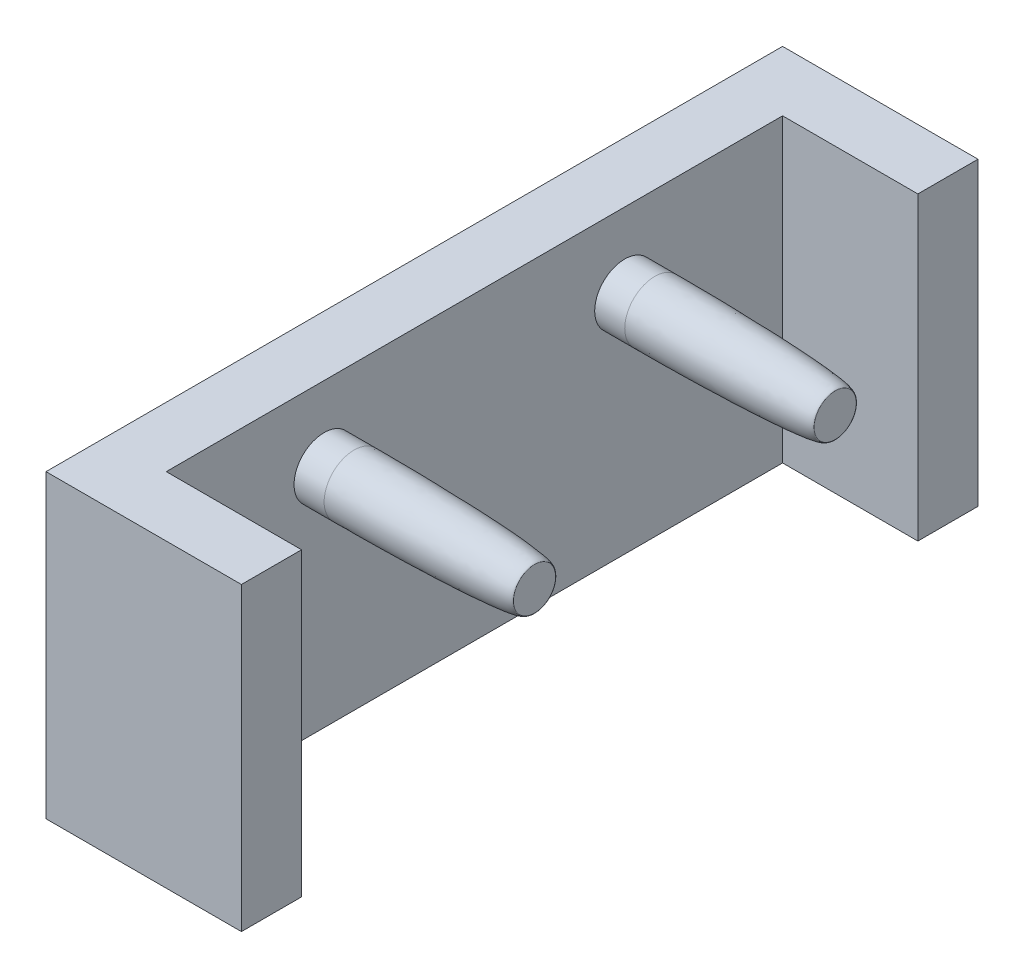
ISO-10303-21;
HEADER;
FILE_DESCRIPTION(('STEP AP214'),'2;1');
FILE_NAME('part.step','',(''),(''),'','','');
FILE_SCHEMA(('AUTOMOTIVE_DESIGN { 1 0 10303 214 1 1 1 1 }'));
ENDSEC;
DATA;
#1=APPLICATION_CONTEXT('core data for automotive mechanical design processes');
#2=APPLICATION_PROTOCOL_DEFINITION('international standard','automotive_design',2000,#1);
#3=PRODUCT_CONTEXT('',#1,'mechanical');
#4=PRODUCT('Part','Part','',(#3));
#5=PRODUCT_RELATED_PRODUCT_CATEGORY('part','',(#4));
#6=PRODUCT_DEFINITION_FORMATION('','',#4);
#7=PRODUCT_DEFINITION_CONTEXT('part definition',#1,'design');
#8=PRODUCT_DEFINITION('design','',#6,#7);
#9=PRODUCT_DEFINITION_SHAPE('','',#8);
#10=(LENGTH_UNIT() NAMED_UNIT(*) SI_UNIT(.MILLI.,.METRE.));
#11=(NAMED_UNIT(*) PLANE_ANGLE_UNIT() SI_UNIT($,.RADIAN.));
#12=(NAMED_UNIT(*) SI_UNIT($,.STERADIAN.) SOLID_ANGLE_UNIT());
#13=UNCERTAINTY_MEASURE_WITH_UNIT(LENGTH_MEASURE(1.E-05),#10,'distance_accuracy_value','');
#14=(GEOMETRIC_REPRESENTATION_CONTEXT(3) GLOBAL_UNCERTAINTY_ASSIGNED_CONTEXT((#13)) GLOBAL_UNIT_ASSIGNED_CONTEXT((#10,
#11,#12)) REPRESENTATION_CONTEXT('',''));
#15=CARTESIAN_POINT('',(0.,0.,0.));
#16=DIRECTION('',(0.,0.,1.));
#17=DIRECTION('',(1.,0.,0.));
#18=AXIS2_PLACEMENT_3D('',#15,#16,#17);
#19=CARTESIAN_POINT('',(7.,0.,5.));
#20=DIRECTION('',(-1.,0.,0.));
#21=DIRECTION('',(0.,0.,1.));
#22=AXIS2_PLACEMENT_3D('',#19,#20,#21);
#23=CYLINDRICAL_SURFACE('',#22,1.);
#24=CARTESIAN_POINT('',(1.,0.,4.));
#25=CARTESIAN_POINT('',(1.,0.261799298751802,4.));
#26=CARTESIAN_POINT('',(1.,0.52198672172927,4.10777315935618));
#27=CARTESIAN_POINT('',(1.,0.892226840643825,4.47801327827073));
#28=CARTESIAN_POINT('',(1.,1.,4.73820070124815));
#29=CARTESIAN_POINT('',(1.,1.,5.26179929875185));
#30=CARTESIAN_POINT('',(1.,0.892226840643745,5.52198672172935));
#31=CARTESIAN_POINT('',(1.,0.521986721729349,5.89222684064375));
#32=CARTESIAN_POINT('',(1.,0.261799298751748,6.));
#33=CARTESIAN_POINT('',(1.,-0.261799298751748,6.));
#34=CARTESIAN_POINT('',(1.,-0.521986721729316,5.89222684064378));
#35=CARTESIAN_POINT('',(1.,-0.89222684064378,5.52198672172932));
#36=CARTESIAN_POINT('',(1.,-1.,5.26179929875169));
#37=CARTESIAN_POINT('',(1.,-1.,4.73820070124831));
#38=CARTESIAN_POINT('',(1.,-0.892226840643798,4.47801327827071));
#39=CARTESIAN_POINT('',(1.,-0.521986721729301,4.1077731593562));
#40=CARTESIAN_POINT('',(1.,-0.261799298751802,4.));
#41=CARTESIAN_POINT('',(1.,0.,4.));
#42=(BOUNDED_CURVE() B_SPLINE_CURVE(3,(#24,#25,#26,#27,#28,#29,#30,#31,#32,#33,#34,#35,#36,#37,
#38,#39,#40,#41),.UNSPECIFIED.,.T.,.F.) B_SPLINE_CURVE_WITH_KNOTS((4,2,2,2,2,2,2,2,4),(0.,
0.785398163397448,1.5707963267949,2.35619449019234,3.14159265358979,3.92699081698724,
4.71238898038469,5.49778714378214,6.28318530717959),
.UNSPECIFIED.) CURVE() GEOMETRIC_REPRESENTATION_ITEM() RATIONAL_B_SPLINE_CURVE((1.,1.,1.,1.,1.,
1.,1.,1.,1.,1.,1.,1.,1.,1.,1.,1.,1.,1.)) REPRESENTATION_ITEM(''));
#43=CARTESIAN_POINT('',(1.,0.,4.));
#44=VERTEX_POINT('',#43);
#45=EDGE_CURVE('E275',#44,#44,#42,.F.);
#46=ORIENTED_EDGE('',*,*,#45,.T.);
#47=EDGE_LOOP('',(#46));
#48=FACE_BOUND('',#47,.T.);
#49=CARTESIAN_POINT('',(0.,0.,5.));
#50=DIRECTION('',(1.,0.,0.));
#51=DIRECTION('',(0.,0.,-1.));
#52=AXIS2_PLACEMENT_3D('',#49,#50,#51);
#53=CIRCLE('',#52,1.);
#54=CARTESIAN_POINT('',(0.,0.,4.));
#55=VERTEX_POINT('',#54);
#56=EDGE_CURVE('E174',#55,#55,#53,.T.);
#57=ORIENTED_EDGE('',*,*,#56,.T.);
#58=EDGE_LOOP('',(#57));
#59=FACE_BOUND('',#58,.T.);
#60=ADVANCED_FACE('F38',(#48,#59),#23,.T.);
#61=CARTESIAN_POINT('',(7.,0.,5.));
#62=DIRECTION('',(1.,0.,0.));
#63=DIRECTION('',(0.,0.,-1.));
#64=AXIS2_PLACEMENT_3D('',#61,#62,#63);
#65=PLANE('',#64);
#66=CARTESIAN_POINT('',(7.,0.,4.3));
#67=CARTESIAN_POINT('',(7.,-0.183259509126262,4.3));
#68=CARTESIAN_POINT('',(7.,-0.365390705210521,4.37544121154935));
#69=CARTESIAN_POINT('',(7.,-0.624558788450648,4.63460929478949));
#70=CARTESIAN_POINT('',(7.,-0.7,4.81674049087378));
#71=CARTESIAN_POINT('',(7.,-0.7,5.18325950912622));
#72=CARTESIAN_POINT('',(7.,-0.624558788450647,5.36539070521055));
#73=CARTESIAN_POINT('',(7.,-0.365390705210519,5.62455878845062));
#74=CARTESIAN_POINT('',(7.,-0.183259509126223,5.7));
#75=CARTESIAN_POINT('',(7.,0.183259509126223,5.7));
#76=CARTESIAN_POINT('',(7.,0.365390705210509,5.62455878845062));
#77=CARTESIAN_POINT('',(7.,0.624558788450657,5.36539070521055));
#78=CARTESIAN_POINT('',(7.,0.7,5.18325950912628));
#79=CARTESIAN_POINT('',(7.,0.7,4.81674049087372));
#80=CARTESIAN_POINT('',(7.,0.624558788450657,4.63460929478952));
#81=CARTESIAN_POINT('',(7.,0.365390705210509,4.37544121154931));
#82=CARTESIAN_POINT('',(7.,0.183259509126262,4.3));
#83=CARTESIAN_POINT('',(7.,0.,4.3));
#84=(BOUNDED_CURVE() B_SPLINE_CURVE(3,(#66,#67,#68,#69,#70,#71,#72,#73,#74,#75,#76,#77,#78,#79,
#80,#81,#82,#83),.UNSPECIFIED.,.T.,.F.) B_SPLINE_CURVE_WITH_KNOTS((4,2,2,2,2,2,2,2,4),(0.,
0.785398163397448,1.5707963267949,2.35619449019234,3.14159265358979,3.92699081698724,
4.71238898038469,5.49778714378214,6.28318530717959),
.UNSPECIFIED.) CURVE() GEOMETRIC_REPRESENTATION_ITEM() RATIONAL_B_SPLINE_CURVE((1.,1.,1.,1.,1.,
1.,1.,1.,1.,1.,1.,1.,1.,1.,1.,1.,1.,1.)) REPRESENTATION_ITEM(''));
#85=CARTESIAN_POINT('',(7.,0.,4.3));
#86=VERTEX_POINT('',#85);
#87=EDGE_CURVE('E186',#86,#86,#84,.F.);
#88=ORIENTED_EDGE('',*,*,#87,.T.);
#89=EDGE_LOOP('',(#88));
#90=FACE_BOUND('',#89,.T.);
#91=ADVANCED_FACE('F197',(#90),#65,.T.);
#92=CARTESIAN_POINT('',(-2.,2.5,-10.25));
#93=DIRECTION('',(0.,-1.,0.));
#94=DIRECTION('',(0.,0.,-1.));
#95=AXIS2_PLACEMENT_3D('',#92,#93,#94);
#96=PLANE('',#95);
#97=DIRECTION('',(0.,0.,-1.));
#98=VECTOR('',#97,1.);
#99=CARTESIAN_POINT('',(0.,2.5,-10.25));
#100=LINE('',#99,#98);
#101=CARTESIAN_POINT('',(0.,2.5,10.25));
#102=VERTEX_POINT('',#101);
#103=CARTESIAN_POINT('',(0.,2.5,-10.25));
#104=VERTEX_POINT('',#103);
#105=EDGE_CURVE('E67',#102,#104,#100,.T.);
#106=ORIENTED_EDGE('',*,*,#105,.T.);
#107=DIRECTION('',(-1.,0.,0.));
#108=VECTOR('',#107,1.);
#109=CARTESIAN_POINT('',(4.5,2.5,-10.25));
#110=LINE('',#109,#108);
#111=CARTESIAN_POINT('',(4.5,2.5,-10.25));
#112=VERTEX_POINT('',#111);
#113=EDGE_CURVE('E166',#112,#104,#110,.T.);
#114=ORIENTED_EDGE('',*,*,#113,.F.);
#115=DIRECTION('',(0.,0.,-1.));
#116=VECTOR('',#115,1.);
#117=CARTESIAN_POINT('',(4.5,2.5,-12.25));
#118=LINE('',#117,#116);
#119=CARTESIAN_POINT('',(4.5,2.5,-12.25));
#120=VERTEX_POINT('',#119);
#121=EDGE_CURVE('E151',#112,#120,#118,.T.);
#122=ORIENTED_EDGE('',*,*,#121,.T.);
#123=DIRECTION('',(-1.,0.,0.));
#124=VECTOR('',#123,1.);
#125=CARTESIAN_POINT('',(4.5,2.5,-12.25));
#126=LINE('',#125,#124);
#127=CARTESIAN_POINT('',(-2.,2.5,-12.25));
#128=VERTEX_POINT('',#127);
#129=EDGE_CURVE('E163',#120,#128,#126,.T.);
#130=ORIENTED_EDGE('',*,*,#129,.T.);
#131=DIRECTION('',(0.,0.,-1.));
#132=VECTOR('',#131,1.);
#133=CARTESIAN_POINT('',(-2.,2.5,-10.25));
#134=LINE('',#133,#132);
#135=CARTESIAN_POINT('',(-2.,2.5,12.25));
#136=VERTEX_POINT('',#135);
#137=EDGE_CURVE('E170',#136,#128,#134,.T.);
#138=ORIENTED_EDGE('',*,*,#137,.F.);
#139=DIRECTION('',(-1.,0.,0.));
#140=VECTOR('',#139,1.);
#141=CARTESIAN_POINT('',(4.5,2.5,12.25));
#142=LINE('',#141,#140);
#143=CARTESIAN_POINT('',(4.5,2.5,12.25));
#144=VERTEX_POINT('',#143);
#145=EDGE_CURVE('E131',#144,#136,#142,.T.);
#146=ORIENTED_EDGE('',*,*,#145,.F.);
#147=DIRECTION('',(0.,0.,-1.));
#148=VECTOR('',#147,1.);
#149=CARTESIAN_POINT('',(4.5,2.5,10.25));
#150=LINE('',#149,#148);
#151=CARTESIAN_POINT('',(4.5,2.5,10.25));
#152=VERTEX_POINT('',#151);
#153=EDGE_CURVE('E124',#144,#152,#150,.T.);
#154=ORIENTED_EDGE('',*,*,#153,.T.);
#155=DIRECTION('',(-1.,0.,0.));
#156=VECTOR('',#155,1.);
#157=CARTESIAN_POINT('',(4.5,2.5,10.25));
#158=LINE('',#157,#156);
#159=EDGE_CURVE('E109',#152,#102,#158,.T.);
#160=ORIENTED_EDGE('',*,*,#159,.T.);
#161=EDGE_LOOP('',(#106,#114,#122,#130,#138,#146,#154,#160));
#162=FACE_BOUND('',#161,.T.);
#163=ADVANCED_FACE('F129',(#162),#96,.F.);
#164=CARTESIAN_POINT('',(-2.,-7.5,-10.25));
#165=DIRECTION('',(0.,1.,0.));
#166=DIRECTION('',(0.,0.,1.));
#167=AXIS2_PLACEMENT_3D('',#164,#165,#166);
#168=PLANE('',#167);
#169=DIRECTION('',(0.,0.,1.));
#170=VECTOR('',#169,1.);
#171=CARTESIAN_POINT('',(0.,-7.5,-10.25));
#172=LINE('',#171,#170);
#173=CARTESIAN_POINT('',(0.,-7.5,-10.25));
#174=VERTEX_POINT('',#173);
#175=CARTESIAN_POINT('',(0.,-7.5,10.25));
#176=VERTEX_POINT('',#175);
#177=EDGE_CURVE('E59',#174,#176,#172,.T.);
#178=ORIENTED_EDGE('',*,*,#177,.T.);
#179=DIRECTION('',(-1.,0.,0.));
#180=VECTOR('',#179,1.);
#181=CARTESIAN_POINT('',(4.5,-7.5,10.25));
#182=LINE('',#181,#180);
#183=CARTESIAN_POINT('',(4.5,-7.5,10.25));
#184=VERTEX_POINT('',#183);
#185=EDGE_CURVE('E116',#184,#176,#182,.T.);
#186=ORIENTED_EDGE('',*,*,#185,.F.);
#187=DIRECTION('',(0.,0.,1.));
#188=VECTOR('',#187,1.);
#189=CARTESIAN_POINT('',(4.5,-7.5,12.25));
#190=LINE('',#189,#188);
#191=CARTESIAN_POINT('',(4.5,-7.5,12.25));
#192=VERTEX_POINT('',#191);
#193=EDGE_CURVE('E127',#184,#192,#190,.T.);
#194=ORIENTED_EDGE('',*,*,#193,.T.);
#195=DIRECTION('',(-1.,0.,0.));
#196=VECTOR('',#195,1.);
#197=CARTESIAN_POINT('',(4.5,-7.5,12.25));
#198=LINE('',#197,#196);
#199=CARTESIAN_POINT('',(-2.,-7.5,12.25));
#200=VERTEX_POINT('',#199);
#201=EDGE_CURVE('E141',#192,#200,#198,.T.);
#202=ORIENTED_EDGE('',*,*,#201,.T.);
#203=DIRECTION('',(0.,0.,1.));
#204=VECTOR('',#203,1.);
#205=CARTESIAN_POINT('',(-2.,-7.5,-10.25));
#206=LINE('',#205,#204);
#207=CARTESIAN_POINT('',(-2.,-7.5,-12.25));
#208=VERTEX_POINT('',#207);
#209=EDGE_CURVE('E172',#208,#200,#206,.T.);
#210=ORIENTED_EDGE('',*,*,#209,.F.);
#211=DIRECTION('',(-1.,0.,0.));
#212=VECTOR('',#211,1.);
#213=CARTESIAN_POINT('',(4.5,-7.5,-12.25));
#214=LINE('',#213,#212);
#215=CARTESIAN_POINT('',(4.5,-7.5,-12.25));
#216=VERTEX_POINT('',#215);
#217=EDGE_CURVE('E160',#216,#208,#214,.T.);
#218=ORIENTED_EDGE('',*,*,#217,.F.);
#219=DIRECTION('',(0.,0.,1.));
#220=VECTOR('',#219,1.);
#221=CARTESIAN_POINT('',(4.5,-7.5,-10.25));
#222=LINE('',#221,#220);
#223=CARTESIAN_POINT('',(4.5,-7.5,-10.25));
#224=VERTEX_POINT('',#223);
#225=EDGE_CURVE('E145',#216,#224,#222,.T.);
#226=ORIENTED_EDGE('',*,*,#225,.T.);
#227=DIRECTION('',(-1.,0.,0.));
#228=VECTOR('',#227,1.);
#229=CARTESIAN_POINT('',(4.5,-7.5,-10.25));
#230=LINE('',#229,#228);
#231=EDGE_CURVE('E157',#224,#174,#230,.T.);
#232=ORIENTED_EDGE('',*,*,#231,.T.);
#233=EDGE_LOOP('',(#178,#186,#194,#202,#210,#218,#226,#232));
#234=FACE_BOUND('',#233,.T.);
#235=ADVANCED_FACE('F302',(#234),#168,.F.);
#236=CARTESIAN_POINT('',(-2.,0.,0.));
#237=DIRECTION('',(-1.,0.,0.));
#238=DIRECTION('',(0.,0.,1.));
#239=AXIS2_PLACEMENT_3D('',#236,#237,#238);
#240=PLANE('',#239);
#241=ORIENTED_EDGE('',*,*,#209,.T.);
#242=DIRECTION('',(0.,1.,0.));
#243=VECTOR('',#242,1.);
#244=CARTESIAN_POINT('',(-2.,-7.5,12.25));
#245=LINE('',#244,#243);
#246=EDGE_CURVE('E132',#200,#136,#245,.T.);
#247=ORIENTED_EDGE('',*,*,#246,.T.);
#248=ORIENTED_EDGE('',*,*,#137,.T.);
#249=DIRECTION('',(0.,-1.,0.));
#250=VECTOR('',#249,1.);
#251=CARTESIAN_POINT('',(-2.,-7.5,-12.25));
#252=LINE('',#251,#250);
#253=EDGE_CURVE('E140',#128,#208,#252,.T.);
#254=ORIENTED_EDGE('',*,*,#253,.T.);
#255=EDGE_LOOP('',(#241,#247,#248,#254));
#256=FACE_BOUND('',#255,.T.);
#257=ADVANCED_FACE('F252',(#256),#240,.T.);
#258=CARTESIAN_POINT('',(0.,0.,0.));
#259=DIRECTION('',(-1.,0.,0.));
#260=DIRECTION('',(0.,0.,1.));
#261=AXIS2_PLACEMENT_3D('',#258,#259,#260);
#262=PLANE('',#261);
#263=CARTESIAN_POINT('',(0.,0.,-5.));
#264=DIRECTION('',(-1.,0.,0.));
#265=DIRECTION('',(0.,0.,1.));
#266=AXIS2_PLACEMENT_3D('',#263,#264,#265);
#267=CIRCLE('',#266,1.);
#268=CARTESIAN_POINT('',(0.,0.,-4.));
#269=VERTEX_POINT('',#268);
#270=EDGE_CURVE('E183',#269,#269,#267,.F.);
#271=ORIENTED_EDGE('',*,*,#270,.F.);
#272=EDGE_LOOP('',(#271));
#273=FACE_BOUND('',#272,.T.);
#274=ORIENTED_EDGE('',*,*,#56,.F.);
#275=EDGE_LOOP('',(#274));
#276=FACE_BOUND('',#275,.T.);
#277=DIRECTION('',(0.,1.,0.));
#278=VECTOR('',#277,1.);
#279=CARTESIAN_POINT('',(0.,2.5,10.25));
#280=LINE('',#279,#278);
#281=EDGE_CURVE('E114',#176,#102,#280,.T.);
#282=ORIENTED_EDGE('',*,*,#281,.F.);
#283=ORIENTED_EDGE('',*,*,#177,.F.);
#284=DIRECTION('',(0.,-1.,0.));
#285=VECTOR('',#284,1.);
#286=CARTESIAN_POINT('',(0.,2.5,-10.25));
#287=LINE('',#286,#285);
#288=EDGE_CURVE('E177',#104,#174,#287,.T.);
#289=ORIENTED_EDGE('',*,*,#288,.F.);
#290=ORIENTED_EDGE('',*,*,#105,.F.);
#291=EDGE_LOOP('',(#282,#283,#289,#290));
#292=FACE_BOUND('',#291,.T.);
#293=ADVANCED_FACE('F250',(#273,#276,#292),#262,.F.);
#294=CARTESIAN_POINT('',(7.,0.,-5.));
#295=DIRECTION('',(-1.,0.,0.));
#296=DIRECTION('',(0.,0.,1.));
#297=AXIS2_PLACEMENT_3D('',#294,#295,#296);
#298=CYLINDRICAL_SURFACE('',#297,1.);
#299=CARTESIAN_POINT('',(1.,0.,-6.));
#300=CARTESIAN_POINT('',(1.,0.261799298751802,-6.));
#301=CARTESIAN_POINT('',(1.,0.52198672172927,-5.89222684064382));
#302=CARTESIAN_POINT('',(1.,0.892226840643825,-5.52198672172927));
#303=CARTESIAN_POINT('',(1.,1.,-5.26179929875185));
#304=CARTESIAN_POINT('',(1.,1.,-4.73820070124815));
#305=CARTESIAN_POINT('',(1.,0.892226840643745,-4.47801327827065));
#306=CARTESIAN_POINT('',(1.,0.521986721729349,-4.10777315935625));
#307=CARTESIAN_POINT('',(1.,0.261799298751748,-4.));
#308=CARTESIAN_POINT('',(1.,-0.261799298751748,-4.));
#309=CARTESIAN_POINT('',(1.,-0.521986721729316,-4.10777315935622));
#310=CARTESIAN_POINT('',(1.,-0.89222684064378,-4.47801327827068));
#311=CARTESIAN_POINT('',(1.,-1.,-4.73820070124831));
#312=CARTESIAN_POINT('',(1.,-1.,-5.26179929875169));
#313=CARTESIAN_POINT('',(1.,-0.892226840643798,-5.5219867217293));
#314=CARTESIAN_POINT('',(1.,-0.521986721729301,-5.8922268406438));
#315=CARTESIAN_POINT('',(1.,-0.261799298751802,-6.));
#316=CARTESIAN_POINT('',(1.,0.,-6.));
#317=(BOUNDED_CURVE() B_SPLINE_CURVE(3,(#299,#300,#301,#302,#303,#304,#305,#306,#307,#308,#309,
#310,#311,#312,#313,#314,#315,#316),.UNSPECIFIED.,.T.,.F.) B_SPLINE_CURVE_WITH_KNOTS((4,2,2,2,2,
2,2,2,4),(0.,0.785398163397448,1.5707963267949,2.35619449019234,3.14159265358979,
3.92699081698724,4.71238898038469,5.49778714378214,6.28318530717959),
.UNSPECIFIED.) CURVE() GEOMETRIC_REPRESENTATION_ITEM() RATIONAL_B_SPLINE_CURVE((1.,1.,1.,1.,1.,
1.,1.,1.,1.,1.,1.,1.,1.,1.,1.,1.,1.,1.)) REPRESENTATION_ITEM(''));
#318=CARTESIAN_POINT('',(1.,0.,-6.));
#319=VERTEX_POINT('',#318);
#320=EDGE_CURVE('E12',#319,#319,#317,.F.);
#321=ORIENTED_EDGE('',*,*,#320,.T.);
#322=EDGE_LOOP('',(#321));
#323=FACE_BOUND('',#322,.T.);
#324=ORIENTED_EDGE('',*,*,#270,.T.);
#325=EDGE_LOOP('',(#324));
#326=FACE_BOUND('',#325,.T.);
#327=ADVANCED_FACE('F244',(#323,#326),#298,.T.);
#328=CARTESIAN_POINT('',(7.,0.,-5.));
#329=DIRECTION('',(1.,0.,0.));
#330=DIRECTION('',(0.,0.,-1.));
#331=AXIS2_PLACEMENT_3D('',#328,#329,#330);
#332=PLANE('',#331);
#333=CARTESIAN_POINT('',(7.,0.,-5.7));
#334=CARTESIAN_POINT('',(7.,-0.183259509126262,-5.7));
#335=CARTESIAN_POINT('',(7.,-0.365390705210521,-5.62455878845065));
#336=CARTESIAN_POINT('',(7.,-0.624558788450648,-5.36539070521051));
#337=CARTESIAN_POINT('',(7.,-0.7,-5.18325950912622));
#338=CARTESIAN_POINT('',(7.,-0.7,-4.81674049087378));
#339=CARTESIAN_POINT('',(7.,-0.624558788450647,-4.63460929478945));
#340=CARTESIAN_POINT('',(7.,-0.365390705210519,-4.37544121154938));
#341=CARTESIAN_POINT('',(7.,-0.183259509126223,-4.3));
#342=CARTESIAN_POINT('',(7.,0.183259509126223,-4.3));
#343=CARTESIAN_POINT('',(7.,0.365390705210509,-4.37544121154938));
#344=CARTESIAN_POINT('',(7.,0.624558788450657,-4.63460929478945));
#345=CARTESIAN_POINT('',(7.,0.7,-4.81674049087372));
#346=CARTESIAN_POINT('',(7.,0.7,-5.18325950912628));
#347=CARTESIAN_POINT('',(7.,0.624558788450657,-5.36539070521048));
#348=CARTESIAN_POINT('',(7.,0.365390705210509,-5.62455878845069));
#349=CARTESIAN_POINT('',(7.,0.183259509126262,-5.7));
#350=CARTESIAN_POINT('',(7.,0.,-5.7));
#351=(BOUNDED_CURVE() B_SPLINE_CURVE(3,(#333,#334,#335,#336,#337,#338,#339,#340,#341,#342,#343,
#344,#345,#346,#347,#348,#349,#350),.UNSPECIFIED.,.T.,.F.) B_SPLINE_CURVE_WITH_KNOTS((4,2,2,2,2,
2,2,2,4),(0.,0.785398163397448,1.5707963267949,2.35619449019234,3.14159265358979,
3.92699081698724,4.71238898038469,5.49778714378214,6.28318530717959),
.UNSPECIFIED.) CURVE() GEOMETRIC_REPRESENTATION_ITEM() RATIONAL_B_SPLINE_CURVE((1.,1.,1.,1.,1.,
1.,1.,1.,1.,1.,1.,1.,1.,1.,1.,1.,1.,1.)) REPRESENTATION_ITEM(''));
#352=CARTESIAN_POINT('',(7.,0.,-5.7));
#353=VERTEX_POINT('',#352);
#354=EDGE_CURVE('E52',#353,#353,#351,.F.);
#355=ORIENTED_EDGE('',*,*,#354,.T.);
#356=EDGE_LOOP('',(#355));
#357=FACE_BOUND('',#356,.T.);
#358=ADVANCED_FACE('F233',(#357),#332,.T.);
#359=CARTESIAN_POINT('',(4.5,-7.5,-12.25));
#360=DIRECTION('',(0.,0.,-1.));
#361=DIRECTION('',(-1.,0.,0.));
#362=AXIS2_PLACEMENT_3D('',#359,#360,#361);
#363=PLANE('',#362);
#364=ORIENTED_EDGE('',*,*,#253,.F.);
#365=ORIENTED_EDGE('',*,*,#129,.F.);
#366=DIRECTION('',(0.,-1.,0.));
#367=VECTOR('',#366,1.);
#368=CARTESIAN_POINT('',(4.5,-7.5,-12.25));
#369=LINE('',#368,#367);
#370=EDGE_CURVE('E154',#120,#216,#369,.T.);
#371=ORIENTED_EDGE('',*,*,#370,.T.);
#372=ORIENTED_EDGE('',*,*,#217,.T.);
#373=EDGE_LOOP('',(#364,#365,#371,#372));
#374=FACE_BOUND('',#373,.T.);
#375=ADVANCED_FACE('F243',(#374),#363,.T.);
#376=CARTESIAN_POINT('',(4.5,2.5,-10.25));
#377=DIRECTION('',(0.,0.,1.));
#378=DIRECTION('',(0.,-1.,0.));
#379=AXIS2_PLACEMENT_3D('',#376,#377,#378);
#380=PLANE('',#379);
#381=ORIENTED_EDGE('',*,*,#113,.T.);
#382=ORIENTED_EDGE('',*,*,#288,.T.);
#383=ORIENTED_EDGE('',*,*,#231,.F.);
#384=DIRECTION('',(0.,1.,0.));
#385=VECTOR('',#384,1.);
#386=CARTESIAN_POINT('',(4.5,2.5,-10.25));
#387=LINE('',#386,#385);
#388=EDGE_CURVE('E148',#224,#112,#387,.T.);
#389=ORIENTED_EDGE('',*,*,#388,.T.);
#390=EDGE_LOOP('',(#381,#382,#383,#389));
#391=FACE_BOUND('',#390,.T.);
#392=ADVANCED_FACE('F245',(#391),#380,.T.);
#393=CARTESIAN_POINT('',(4.5,0.,0.));
#394=DIRECTION('',(1.,0.,0.));
#395=DIRECTION('',(0.,0.,-1.));
#396=AXIS2_PLACEMENT_3D('',#393,#394,#395);
#397=PLANE('',#396);
#398=ORIENTED_EDGE('',*,*,#225,.F.);
#399=ORIENTED_EDGE('',*,*,#370,.F.);
#400=ORIENTED_EDGE('',*,*,#121,.F.);
#401=ORIENTED_EDGE('',*,*,#388,.F.);
#402=EDGE_LOOP('',(#398,#399,#400,#401));
#403=FACE_BOUND('',#402,.T.);
#404=ADVANCED_FACE('F313',(#403),#397,.T.);
#405=CARTESIAN_POINT('',(4.5,-7.5,12.25));
#406=DIRECTION('',(0.,0.,1.));
#407=DIRECTION('',(1.,0.,0.));
#408=AXIS2_PLACEMENT_3D('',#405,#406,#407);
#409=PLANE('',#408);
#410=ORIENTED_EDGE('',*,*,#246,.F.);
#411=ORIENTED_EDGE('',*,*,#201,.F.);
#412=DIRECTION('',(0.,1.,0.));
#413=VECTOR('',#412,1.);
#414=CARTESIAN_POINT('',(4.5,-7.5,12.25));
#415=LINE('',#414,#413);
#416=EDGE_CURVE('E117',#192,#144,#415,.T.);
#417=ORIENTED_EDGE('',*,*,#416,.T.);
#418=ORIENTED_EDGE('',*,*,#145,.T.);
#419=EDGE_LOOP('',(#410,#411,#417,#418));
#420=FACE_BOUND('',#419,.T.);
#421=ADVANCED_FACE('F305',(#420),#409,.T.);
#422=CARTESIAN_POINT('',(4.5,-7.5,10.25));
#423=DIRECTION('',(0.,0.,-1.));
#424=DIRECTION('',(0.,1.,0.));
#425=AXIS2_PLACEMENT_3D('',#422,#423,#424);
#426=PLANE('',#425);
#427=ORIENTED_EDGE('',*,*,#185,.T.);
#428=ORIENTED_EDGE('',*,*,#281,.T.);
#429=ORIENTED_EDGE('',*,*,#159,.F.);
#430=DIRECTION('',(0.,-1.,0.));
#431=VECTOR('',#430,1.);
#432=CARTESIAN_POINT('',(4.5,-7.5,10.25));
#433=LINE('',#432,#431);
#434=EDGE_CURVE('E113',#152,#184,#433,.T.);
#435=ORIENTED_EDGE('',*,*,#434,.T.);
#436=EDGE_LOOP('',(#427,#428,#429,#435));
#437=FACE_BOUND('',#436,.T.);
#438=ADVANCED_FACE('F112',(#437),#426,.T.);
#439=CARTESIAN_POINT('',(4.5,0.,0.));
#440=DIRECTION('',(-1.,0.,0.));
#441=DIRECTION('',(0.,0.,1.));
#442=AXIS2_PLACEMENT_3D('',#439,#440,#441);
#443=PLANE('',#442);
#444=ORIENTED_EDGE('',*,*,#153,.F.);
#445=ORIENTED_EDGE('',*,*,#416,.F.);
#446=ORIENTED_EDGE('',*,*,#193,.F.);
#447=ORIENTED_EDGE('',*,*,#434,.F.);
#448=EDGE_LOOP('',(#444,#445,#446,#447));
#449=FACE_BOUND('',#448,.T.);
#450=ADVANCED_FACE('F122',(#449),#443,.F.);
#451=CARTESIAN_POINT('',(7.,0.,4.3));
#452=CARTESIAN_POINT('',(7.,0.183259509126262,4.3));
#453=CARTESIAN_POINT('',(7.,0.365390705210509,4.37544121154931));
#454=CARTESIAN_POINT('',(7.,0.624558788450657,4.63460929478952));
#455=CARTESIAN_POINT('',(7.,0.7,4.81674049087372));
#456=CARTESIAN_POINT('',(7.,0.7,5.18325950912628));
#457=CARTESIAN_POINT('',(7.,0.624558788450657,5.36539070521055));
#458=CARTESIAN_POINT('',(7.,0.365390705210509,5.62455878845062));
#459=CARTESIAN_POINT('',(7.,0.183259509126223,5.7));
#460=CARTESIAN_POINT('',(7.,-0.183259509126223,5.7));
#461=CARTESIAN_POINT('',(7.,-0.365390705210519,5.62455878845062));
#462=CARTESIAN_POINT('',(7.,-0.624558788450647,5.36539070521055));
#463=CARTESIAN_POINT('',(7.,-0.7,5.18325950912622));
#464=CARTESIAN_POINT('',(7.,-0.7,4.81674049087378));
#465=CARTESIAN_POINT('',(7.,-0.624558788450648,4.63460929478949));
#466=CARTESIAN_POINT('',(7.,-0.365390705210521,4.37544121154935));
#467=CARTESIAN_POINT('',(7.,-0.183259509126262,4.3));
#468=CARTESIAN_POINT('',(7.,0.,4.3));
#469=CARTESIAN_POINT('',(7.,0.,4.));
#470=CARTESIAN_POINT('',(7.,0.261799298751802,4.));
#471=CARTESIAN_POINT('',(7.00000000000008,0.521986721729295,4.10777315935615));
#472=CARTESIAN_POINT('',(6.99999999999992,0.8922268406438,4.47801327827075));
#473=CARTESIAN_POINT('',(7.,1.,4.73820070124815));
#474=CARTESIAN_POINT('',(7.,1.,5.26179929875185));
#475=CARTESIAN_POINT('',(7.,0.892226840643784,5.52198672172939));
#476=CARTESIAN_POINT('',(7.,0.52198672172931,5.89222684064371));
#477=CARTESIAN_POINT('',(7.,0.261799298751748,6.));
#478=CARTESIAN_POINT('',(7.,-0.261799298751748,6.));
#479=CARTESIAN_POINT('',(7.,-0.52198672172936,5.89222684064378));
#480=CARTESIAN_POINT('',(7.,-0.892226840643735,5.52198672172931));
#481=CARTESIAN_POINT('',(7.,-1.,5.26179929875169));
#482=CARTESIAN_POINT('',(7.,-1.,4.73820070124831));
#483=CARTESIAN_POINT('',(6.99999999999992,-0.892226840643789,4.47801327827071));
#484=CARTESIAN_POINT('',(7.00000000000008,-0.52198672172931,4.1077731593562));
#485=CARTESIAN_POINT('',(7.,-0.261799298751802,4.));
#486=CARTESIAN_POINT('',(7.,0.,4.));
#487=CARTESIAN_POINT('',(1.,0.,4.));
#488=CARTESIAN_POINT('',(1.,0.261799298751802,4.));
#489=CARTESIAN_POINT('',(1.,0.52198672172927,4.10777315935618));
#490=CARTESIAN_POINT('',(1.,0.892226840643825,4.47801327827073));
#491=CARTESIAN_POINT('',(1.,1.,4.73820070124815));
#492=CARTESIAN_POINT('',(1.,1.,5.26179929875185));
#493=CARTESIAN_POINT('',(1.,0.892226840643745,5.52198672172935));
#494=CARTESIAN_POINT('',(1.,0.521986721729349,5.89222684064375));
#495=CARTESIAN_POINT('',(1.,0.261799298751748,6.));
#496=CARTESIAN_POINT('',(1.,-0.261799298751748,6.));
#497=CARTESIAN_POINT('',(1.,-0.521986721729316,5.89222684064378));
#498=CARTESIAN_POINT('',(1.,-0.89222684064378,5.52198672172932));
#499=CARTESIAN_POINT('',(1.,-1.,5.26179929875169));
#500=CARTESIAN_POINT('',(1.,-1.,4.73820070124831));
#501=CARTESIAN_POINT('',(1.,-0.892226840643798,4.47801327827071));
#502=CARTESIAN_POINT('',(1.,-0.521986721729301,4.1077731593562));
#503=CARTESIAN_POINT('',(1.,-0.261799298751802,4.));
#504=CARTESIAN_POINT('',(1.,0.,4.));
#505=(BOUNDED_SURFACE() B_SPLINE_SURFACE(2,3,((#451,#452,#453,#454,#455,#456,#457,#458,#459,
#460,#461,#462,#463,#464,#465,#466,#467,#468),(#469,#470,#471,#472,#473,#474,#475,#476,#477,
#478,#479,#480,#481,#482,#483,#484,#485,#486),(#487,#488,#489,#490,#491,#492,#493,#494,#495,
#496,#497,#498,#499,#500,#501,#502,#503,#504)),.UNSPECIFIED.,.F.,.T.,
.F.) B_SPLINE_SURFACE_WITH_KNOTS((3,3),(4,2,2,2,2,2,2,2,4),(0.,1.),(0.,0.785398163397448,
1.5707963267949,2.35619449019234,3.14159265358979,3.92699081698724,4.71238898038469,
5.49778714378214,6.28318530717959),
.UNSPECIFIED.) GEOMETRIC_REPRESENTATION_ITEM() RATIONAL_B_SPLINE_SURFACE(((1.,1.,1.,1.,1.,1.,1.,
1.,1.,1.,1.,1.,1.,1.,1.,1.,1.,1.),(0.707106781186548,0.707106781186548,0.707106781186548,
0.707106781186548,0.707106781186548,0.707106781186548,0.707106781186548,0.707106781186548,
0.707106781186548,0.707106781186548,0.707106781186548,0.707106781186548,0.707106781186548,
0.707106781186548,0.707106781186548,0.707106781186548,0.707106781186548,0.707106781186548),(1.,
1.,1.,1.,1.,1.,1.,1.,1.,1.,1.,1.,1.,1.,1.,1.,1.,1.))) REPRESENTATION_ITEM('') SURFACE());
#506=ORIENTED_EDGE('',*,*,#45,.F.);
#507=EDGE_LOOP('',(#506));
#508=FACE_BOUND('',#507,.T.);
#509=ORIENTED_EDGE('',*,*,#87,.F.);
#510=EDGE_LOOP('',(#509));
#511=FACE_BOUND('',#510,.T.);
#512=ADVANCED_FACE('F212',(#508,#511),#505,.T.);
#513=CARTESIAN_POINT('',(7.,0.,-5.7));
#514=CARTESIAN_POINT('',(7.,0.183259509126262,-5.7));
#515=CARTESIAN_POINT('',(7.,0.365390705210509,-5.62455878845069));
#516=CARTESIAN_POINT('',(7.,0.624558788450657,-5.36539070521048));
#517=CARTESIAN_POINT('',(7.,0.7,-5.18325950912628));
#518=CARTESIAN_POINT('',(7.,0.7,-4.81674049087372));
#519=CARTESIAN_POINT('',(7.,0.624558788450657,-4.63460929478945));
#520=CARTESIAN_POINT('',(7.,0.365390705210509,-4.37544121154938));
#521=CARTESIAN_POINT('',(7.,0.183259509126223,-4.3));
#522=CARTESIAN_POINT('',(7.,-0.183259509126223,-4.3));
#523=CARTESIAN_POINT('',(7.,-0.365390705210519,-4.37544121154938));
#524=CARTESIAN_POINT('',(7.,-0.624558788450647,-4.63460929478945));
#525=CARTESIAN_POINT('',(7.,-0.7,-4.81674049087378));
#526=CARTESIAN_POINT('',(7.,-0.7,-5.18325950912622));
#527=CARTESIAN_POINT('',(7.,-0.624558788450648,-5.36539070521051));
#528=CARTESIAN_POINT('',(7.,-0.365390705210521,-5.62455878845065));
#529=CARTESIAN_POINT('',(7.,-0.183259509126262,-5.7));
#530=CARTESIAN_POINT('',(7.,0.,-5.7));
#531=CARTESIAN_POINT('',(7.,0.,-6.));
#532=CARTESIAN_POINT('',(7.,0.261799298751802,-6.));
#533=CARTESIAN_POINT('',(7.00000000000008,0.521986721729295,-5.89222684064385));
#534=CARTESIAN_POINT('',(6.99999999999992,0.8922268406438,-5.52198672172925));
#535=CARTESIAN_POINT('',(7.,1.,-5.26179929875185));
#536=CARTESIAN_POINT('',(7.,1.,-4.73820070124815));
#537=CARTESIAN_POINT('',(7.,0.892226840643784,-4.47801327827061));
#538=CARTESIAN_POINT('',(7.,0.52198672172931,-4.10777315935629));
#539=CARTESIAN_POINT('',(7.,0.261799298751748,-4.));
#540=CARTESIAN_POINT('',(7.,-0.261799298751748,-4.));
#541=CARTESIAN_POINT('',(7.,-0.52198672172932,-4.10777315935622));
#542=CARTESIAN_POINT('',(7.,-0.892226840643775,-4.47801327827069));
#543=CARTESIAN_POINT('',(7.,-1.,-4.73820070124831));
#544=CARTESIAN_POINT('',(7.,-1.,-5.26179929875169));
#545=CARTESIAN_POINT('',(6.99999999999992,-0.892226840643828,-5.52198672172921));
#546=CARTESIAN_POINT('',(7.00000000000008,-0.52198672172927,-5.89222684064389));
#547=CARTESIAN_POINT('',(7.,-0.261799298751802,-6.));
#548=CARTESIAN_POINT('',(7.,0.,-6.));
#549=CARTESIAN_POINT('',(1.,0.,-6.));
#550=CARTESIAN_POINT('',(1.,0.261799298751802,-6.));
#551=CARTESIAN_POINT('',(1.,0.52198672172927,-5.89222684064382));
#552=CARTESIAN_POINT('',(1.,0.892226840643825,-5.52198672172927));
#553=CARTESIAN_POINT('',(1.,1.,-5.26179929875185));
#554=CARTESIAN_POINT('',(1.,1.,-4.73820070124815));
#555=CARTESIAN_POINT('',(1.,0.892226840643745,-4.47801327827065));
#556=CARTESIAN_POINT('',(1.,0.521986721729349,-4.10777315935625));
#557=CARTESIAN_POINT('',(1.,0.261799298751748,-4.));
#558=CARTESIAN_POINT('',(1.,-0.261799298751748,-4.));
#559=CARTESIAN_POINT('',(1.,-0.521986721729316,-4.10777315935622));
#560=CARTESIAN_POINT('',(1.,-0.89222684064378,-4.47801327827068));
#561=CARTESIAN_POINT('',(1.,-1.,-4.73820070124831));
#562=CARTESIAN_POINT('',(1.,-1.,-5.26179929875169));
#563=CARTESIAN_POINT('',(1.,-0.892226840643798,-5.5219867217293));
#564=CARTESIAN_POINT('',(1.,-0.521986721729301,-5.8922268406438));
#565=CARTESIAN_POINT('',(1.,-0.261799298751802,-6.));
#566=CARTESIAN_POINT('',(1.,0.,-6.));
#567=(BOUNDED_SURFACE() B_SPLINE_SURFACE(2,3,((#513,#514,#515,#516,#517,#518,#519,#520,#521,
#522,#523,#524,#525,#526,#527,#528,#529,#530),(#531,#532,#533,#534,#535,#536,#537,#538,#539,
#540,#541,#542,#543,#544,#545,#546,#547,#548),(#549,#550,#551,#552,#553,#554,#555,#556,#557,
#558,#559,#560,#561,#562,#563,#564,#565,#566)),.UNSPECIFIED.,.F.,.T.,
.F.) B_SPLINE_SURFACE_WITH_KNOTS((3,3),(4,2,2,2,2,2,2,2,4),(0.,1.),(0.,0.785398163397448,
1.5707963267949,2.35619449019234,3.14159265358979,3.92699081698724,4.71238898038469,
5.49778714378214,6.28318530717959),
.UNSPECIFIED.) GEOMETRIC_REPRESENTATION_ITEM() RATIONAL_B_SPLINE_SURFACE(((1.,1.,1.,1.,1.,1.,1.,
1.,1.,1.,1.,1.,1.,1.,1.,1.,1.,1.),(0.707106781186548,0.707106781186548,0.707106781186548,
0.707106781186548,0.707106781186548,0.707106781186548,0.707106781186548,0.707106781186548,
0.707106781186548,0.707106781186548,0.707106781186548,0.707106781186548,0.707106781186548,
0.707106781186548,0.707106781186548,0.707106781186548,0.707106781186548,0.707106781186548),(1.,
1.,1.,1.,1.,1.,1.,1.,1.,1.,1.,1.,1.,1.,1.,1.,1.,1.))) REPRESENTATION_ITEM('') SURFACE());
#568=ORIENTED_EDGE('',*,*,#320,.F.);
#569=EDGE_LOOP('',(#568));
#570=FACE_BOUND('',#569,.T.);
#571=ORIENTED_EDGE('',*,*,#354,.F.);
#572=EDGE_LOOP('',(#571));
#573=FACE_BOUND('',#572,.T.);
#574=ADVANCED_FACE('F41',(#570,#573),#567,.T.);
#575=CLOSED_SHELL('',(#60,#91,#163,#235,#257,#293,#327,#358,#375,#392,#404,#421,#438,#450,#512,#574));
#576=MANIFOLD_SOLID_BREP('B2',#575);
#577=ADVANCED_BREP_SHAPE_REPRESENTATION('',(#18,#576),#14);
#578=SHAPE_DEFINITION_REPRESENTATION(#9,#577);
ENDSEC;
END-ISO-10303-21;
